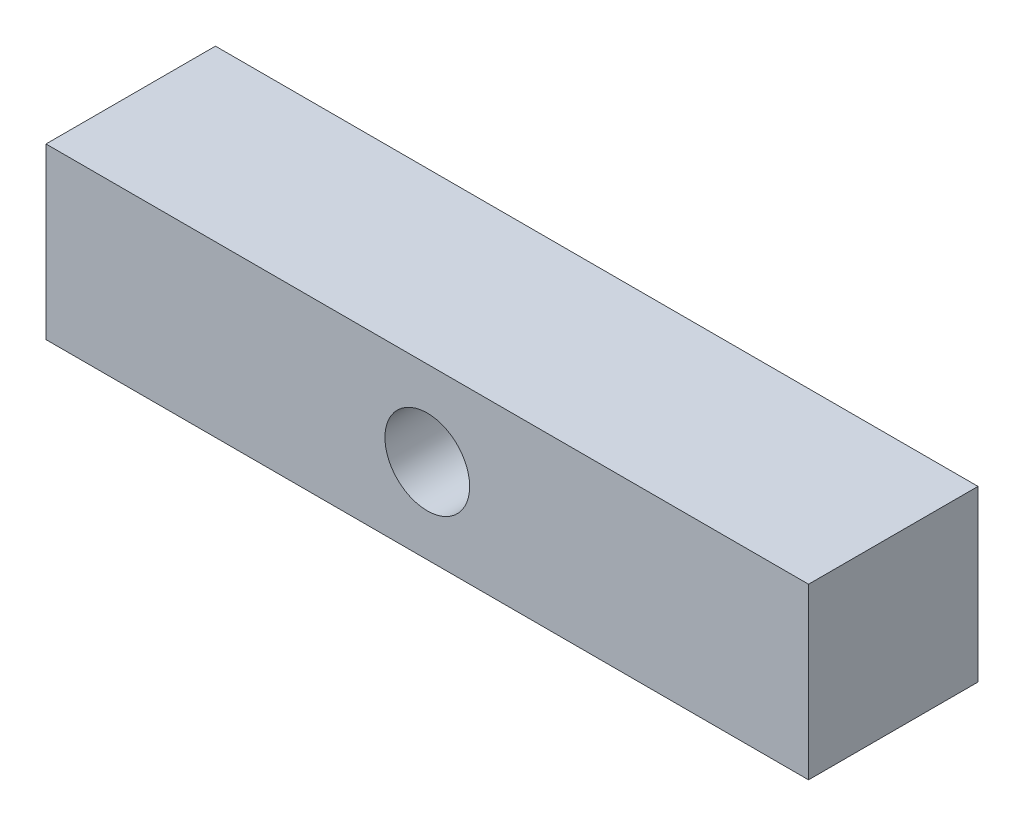
ISO-10303-21;
HEADER;
FILE_DESCRIPTION(('STEP AP214'),'2;1');
FILE_NAME('part.step','',(''),(''),'','','');
FILE_SCHEMA(('AUTOMOTIVE_DESIGN { 1 0 10303 214 1 1 1 1 }'));
ENDSEC;
DATA;
#1=APPLICATION_CONTEXT('core data for automotive mechanical design processes');
#2=APPLICATION_PROTOCOL_DEFINITION('international standard','automotive_design',2000,#1);
#3=PRODUCT_CONTEXT('',#1,'mechanical');
#4=PRODUCT('Part','Part','',(#3));
#5=PRODUCT_RELATED_PRODUCT_CATEGORY('part','',(#4));
#6=PRODUCT_DEFINITION_FORMATION('','',#4);
#7=PRODUCT_DEFINITION_CONTEXT('part definition',#1,'design');
#8=PRODUCT_DEFINITION('design','',#6,#7);
#9=PRODUCT_DEFINITION_SHAPE('','',#8);
#10=(LENGTH_UNIT() NAMED_UNIT(*) SI_UNIT(.MILLI.,.METRE.));
#11=(NAMED_UNIT(*) PLANE_ANGLE_UNIT() SI_UNIT($,.RADIAN.));
#12=(NAMED_UNIT(*) SI_UNIT($,.STERADIAN.) SOLID_ANGLE_UNIT());
#13=UNCERTAINTY_MEASURE_WITH_UNIT(LENGTH_MEASURE(1.E-05),#10,'distance_accuracy_value','');
#14=(GEOMETRIC_REPRESENTATION_CONTEXT(3) GLOBAL_UNCERTAINTY_ASSIGNED_CONTEXT((#13)) GLOBAL_UNIT_ASSIGNED_CONTEXT((#10,
#11,#12)) REPRESENTATION_CONTEXT('',''));
#15=CARTESIAN_POINT('',(0.,0.,0.));
#16=DIRECTION('',(0.,0.,1.));
#17=DIRECTION('',(1.,0.,0.));
#18=AXIS2_PLACEMENT_3D('',#15,#16,#17);
#19=CARTESIAN_POINT('',(0.,0.,25.4));
#20=DIRECTION('',(1.,0.,0.));
#21=DIRECTION('',(0.,0.,-1.));
#22=AXIS2_PLACEMENT_3D('',#19,#20,#21);
#23=PLANE('',#22);
#24=DIRECTION('',(0.,-1.,0.));
#25=VECTOR('',#24,1.);
#26=CARTESIAN_POINT('',(0.,0.,0.));
#27=LINE('',#26,#25);
#28=CARTESIAN_POINT('',(0.,25.4,0.));
#29=VERTEX_POINT('',#28);
#30=CARTESIAN_POINT('',(0.,0.,0.));
#31=VERTEX_POINT('',#30);
#32=EDGE_CURVE('E96',#29,#31,#27,.T.);
#33=ORIENTED_EDGE('',*,*,#32,.T.);
#34=DIRECTION('',(0.,0.,-1.));
#35=VECTOR('',#34,1.);
#36=CARTESIAN_POINT('',(0.,0.,25.4));
#37=LINE('',#36,#35);
#38=CARTESIAN_POINT('',(0.,0.,25.4));
#39=VERTEX_POINT('',#38);
#40=EDGE_CURVE('E11',#39,#31,#37,.T.);
#41=ORIENTED_EDGE('',*,*,#40,.F.);
#42=DIRECTION('',(0.,-1.,0.));
#43=VECTOR('',#42,1.);
#44=CARTESIAN_POINT('',(0.,0.,25.4));
#45=LINE('',#44,#43);
#46=CARTESIAN_POINT('',(0.,25.4,25.4));
#47=VERTEX_POINT('',#46);
#48=EDGE_CURVE('E84',#47,#39,#45,.T.);
#49=ORIENTED_EDGE('',*,*,#48,.F.);
#50=DIRECTION('',(0.,0.,-1.));
#51=VECTOR('',#50,1.);
#52=CARTESIAN_POINT('',(0.,25.4,25.4));
#53=LINE('',#52,#51);
#54=EDGE_CURVE('E92',#47,#29,#53,.T.);
#55=ORIENTED_EDGE('',*,*,#54,.T.);
#56=EDGE_LOOP('',(#33,#41,#49,#55));
#57=FACE_BOUND('',#56,.T.);
#58=ADVANCED_FACE('F33',(#57),#23,.F.);
#59=CARTESIAN_POINT('',(0.,0.,25.4));
#60=DIRECTION('',(0.,1.,0.));
#61=DIRECTION('',(0.,0.,1.));
#62=AXIS2_PLACEMENT_3D('',#59,#60,#61);
#63=PLANE('',#62);
#64=DIRECTION('',(1.,0.,0.));
#65=VECTOR('',#64,1.);
#66=CARTESIAN_POINT('',(0.,0.,0.));
#67=LINE('',#66,#65);
#68=CARTESIAN_POINT('',(114.3,0.,0.));
#69=VERTEX_POINT('',#68);
#70=EDGE_CURVE('E88',#31,#69,#67,.T.);
#71=ORIENTED_EDGE('',*,*,#70,.T.);
#72=DIRECTION('',(0.,0.,-1.));
#73=VECTOR('',#72,1.);
#74=CARTESIAN_POINT('',(114.3,0.,25.4));
#75=LINE('',#74,#73);
#76=CARTESIAN_POINT('',(114.3,0.,25.4));
#77=VERTEX_POINT('',#76);
#78=EDGE_CURVE('E41',#77,#69,#75,.T.);
#79=ORIENTED_EDGE('',*,*,#78,.F.);
#80=DIRECTION('',(1.,0.,0.));
#81=VECTOR('',#80,1.);
#82=CARTESIAN_POINT('',(0.,0.,25.4));
#83=LINE('',#82,#81);
#84=EDGE_CURVE('E79',#39,#77,#83,.T.);
#85=ORIENTED_EDGE('',*,*,#84,.F.);
#86=ORIENTED_EDGE('',*,*,#40,.T.);
#87=EDGE_LOOP('',(#71,#79,#85,#86));
#88=FACE_BOUND('',#87,.T.);
#89=ADVANCED_FACE('F87',(#88),#63,.F.);
#90=CARTESIAN_POINT('',(114.3,0.,25.4));
#91=DIRECTION('',(-1.,0.,0.));
#92=DIRECTION('',(0.,0.,1.));
#93=AXIS2_PLACEMENT_3D('',#90,#91,#92);
#94=PLANE('',#93);
#95=DIRECTION('',(0.,1.,0.));
#96=VECTOR('',#95,1.);
#97=CARTESIAN_POINT('',(114.3,0.,0.));
#98=LINE('',#97,#96);
#99=CARTESIAN_POINT('',(114.3,25.4,0.));
#100=VERTEX_POINT('',#99);
#101=EDGE_CURVE('E66',#69,#100,#98,.T.);
#102=ORIENTED_EDGE('',*,*,#101,.T.);
#103=DIRECTION('',(0.,0.,-1.));
#104=VECTOR('',#103,1.);
#105=CARTESIAN_POINT('',(114.3,25.4,25.4));
#106=LINE('',#105,#104);
#107=CARTESIAN_POINT('',(114.3,25.4,25.4));
#108=VERTEX_POINT('',#107);
#109=EDGE_CURVE('E89',#108,#100,#106,.T.);
#110=ORIENTED_EDGE('',*,*,#109,.F.);
#111=DIRECTION('',(0.,1.,0.));
#112=VECTOR('',#111,1.);
#113=CARTESIAN_POINT('',(114.3,0.,25.4));
#114=LINE('',#113,#112);
#115=EDGE_CURVE('E82',#77,#108,#114,.T.);
#116=ORIENTED_EDGE('',*,*,#115,.F.);
#117=ORIENTED_EDGE('',*,*,#78,.T.);
#118=EDGE_LOOP('',(#102,#110,#116,#117));
#119=FACE_BOUND('',#118,.T.);
#120=ADVANCED_FACE('F90',(#119),#94,.F.);
#121=CARTESIAN_POINT('',(0.,25.4,25.4));
#122=DIRECTION('',(0.,-1.,0.));
#123=DIRECTION('',(0.,0.,-1.));
#124=AXIS2_PLACEMENT_3D('',#121,#122,#123);
#125=PLANE('',#124);
#126=DIRECTION('',(-1.,0.,0.));
#127=VECTOR('',#126,1.);
#128=CARTESIAN_POINT('',(0.,25.4,0.));
#129=LINE('',#128,#127);
#130=EDGE_CURVE('E72',#100,#29,#129,.T.);
#131=ORIENTED_EDGE('',*,*,#130,.T.);
#132=ORIENTED_EDGE('',*,*,#54,.F.);
#133=DIRECTION('',(-1.,0.,0.));
#134=VECTOR('',#133,1.);
#135=CARTESIAN_POINT('',(0.,25.4,25.4));
#136=LINE('',#135,#134);
#137=EDGE_CURVE('E49',#108,#47,#136,.T.);
#138=ORIENTED_EDGE('',*,*,#137,.F.);
#139=ORIENTED_EDGE('',*,*,#109,.T.);
#140=EDGE_LOOP('',(#131,#132,#138,#139));
#141=FACE_BOUND('',#140,.T.);
#142=ADVANCED_FACE('F104',(#141),#125,.F.);
#143=CARTESIAN_POINT('',(0.,0.,25.4));
#144=DIRECTION('',(0.,0.,-1.));
#145=DIRECTION('',(-1.,0.,0.));
#146=AXIS2_PLACEMENT_3D('',#143,#144,#145);
#147=PLANE('',#146);
#148=CARTESIAN_POINT('',(57.15,12.7,25.4));
#149=DIRECTION('',(0.,0.,1.));
#150=DIRECTION('',(1.,0.,0.));
#151=AXIS2_PLACEMENT_3D('',#148,#149,#150);
#152=CIRCLE('',#151,6.35);
#153=CARTESIAN_POINT('',(63.5,12.7,25.4));
#154=VERTEX_POINT('',#153);
#155=EDGE_CURVE('E110',#154,#154,#152,.T.);
#156=ORIENTED_EDGE('',*,*,#155,.F.);
#157=EDGE_LOOP('',(#156));
#158=FACE_BOUND('',#157,.T.);
#159=ORIENTED_EDGE('',*,*,#48,.T.);
#160=ORIENTED_EDGE('',*,*,#84,.T.);
#161=ORIENTED_EDGE('',*,*,#115,.T.);
#162=ORIENTED_EDGE('',*,*,#137,.T.);
#163=EDGE_LOOP('',(#159,#160,#161,#162));
#164=FACE_BOUND('',#163,.T.);
#165=ADVANCED_FACE('F80',(#158,#164),#147,.F.);
#166=CARTESIAN_POINT('',(0.,0.,0.));
#167=DIRECTION('',(0.,0.,-1.));
#168=DIRECTION('',(-1.,0.,0.));
#169=AXIS2_PLACEMENT_3D('',#166,#167,#168);
#170=PLANE('',#169);
#171=CARTESIAN_POINT('',(57.15,12.7,0.));
#172=DIRECTION('',(0.,0.,1.));
#173=DIRECTION('',(1.,0.,0.));
#174=AXIS2_PLACEMENT_3D('',#171,#172,#173);
#175=CIRCLE('',#174,6.35);
#176=CARTESIAN_POINT('',(63.5,12.7,0.));
#177=VERTEX_POINT('',#176);
#178=EDGE_CURVE('E99',#177,#177,#175,.T.);
#179=ORIENTED_EDGE('',*,*,#178,.T.);
#180=EDGE_LOOP('',(#179));
#181=FACE_BOUND('',#180,.T.);
#182=ORIENTED_EDGE('',*,*,#32,.F.);
#183=ORIENTED_EDGE('',*,*,#130,.F.);
#184=ORIENTED_EDGE('',*,*,#101,.F.);
#185=ORIENTED_EDGE('',*,*,#70,.F.);
#186=EDGE_LOOP('',(#182,#183,#184,#185));
#187=FACE_BOUND('',#186,.T.);
#188=ADVANCED_FACE('F107',(#181,#187),#170,.T.);
#189=CARTESIAN_POINT('',(57.15,12.7,0.));
#190=DIRECTION('',(0.,0.,1.));
#191=DIRECTION('',(1.,0.,0.));
#192=AXIS2_PLACEMENT_3D('',#189,#190,#191);
#193=CYLINDRICAL_SURFACE('',#192,6.35);
#194=ORIENTED_EDGE('',*,*,#178,.F.);
#195=EDGE_LOOP('',(#194));
#196=FACE_BOUND('',#195,.T.);
#197=ORIENTED_EDGE('',*,*,#155,.T.);
#198=EDGE_LOOP('',(#197));
#199=FACE_BOUND('',#198,.T.);
#200=ADVANCED_FACE('F117',(#196,#199),#193,.F.);
#201=CLOSED_SHELL('',(#58,#89,#120,#142,#165,#188,#200));
#202=MANIFOLD_SOLID_BREP('B2',#201);
#203=ADVANCED_BREP_SHAPE_REPRESENTATION('',(#18,#202),#14);
#204=SHAPE_DEFINITION_REPRESENTATION(#9,#203);
ENDSEC;
END-ISO-10303-21;
